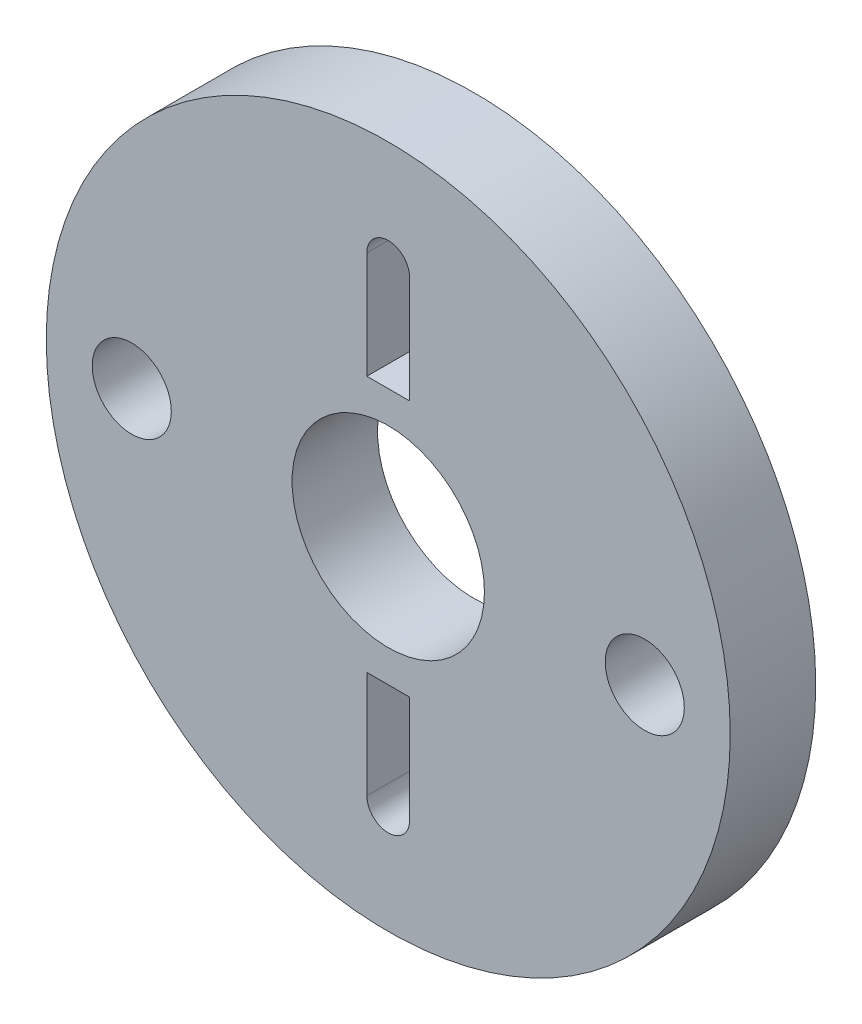
ISO-10303-21;
HEADER;
FILE_DESCRIPTION(('STEP AP214'),'2;1');
FILE_NAME('part.step','',(''),(''),'','','');
FILE_SCHEMA(('AUTOMOTIVE_DESIGN { 1 0 10303 214 1 1 1 1 }'));
ENDSEC;
DATA;
#1=APPLICATION_CONTEXT('core data for automotive mechanical design processes');
#2=APPLICATION_PROTOCOL_DEFINITION('international standard','automotive_design',2000,#1);
#3=PRODUCT_CONTEXT('',#1,'mechanical');
#4=PRODUCT('Part','Part','',(#3));
#5=PRODUCT_RELATED_PRODUCT_CATEGORY('part','',(#4));
#6=PRODUCT_DEFINITION_FORMATION('','',#4);
#7=PRODUCT_DEFINITION_CONTEXT('part definition',#1,'design');
#8=PRODUCT_DEFINITION('design','',#6,#7);
#9=PRODUCT_DEFINITION_SHAPE('','',#8);
#10=(LENGTH_UNIT() NAMED_UNIT(*) SI_UNIT(.MILLI.,.METRE.));
#11=(NAMED_UNIT(*) PLANE_ANGLE_UNIT() SI_UNIT($,.RADIAN.));
#12=(NAMED_UNIT(*) SI_UNIT($,.STERADIAN.) SOLID_ANGLE_UNIT());
#13=UNCERTAINTY_MEASURE_WITH_UNIT(LENGTH_MEASURE(1.E-05),#10,'distance_accuracy_value','');
#14=(GEOMETRIC_REPRESENTATION_CONTEXT(3) GLOBAL_UNCERTAINTY_ASSIGNED_CONTEXT((#13)) GLOBAL_UNIT_ASSIGNED_CONTEXT((#10,
#11,#12)) REPRESENTATION_CONTEXT('',''));
#15=CARTESIAN_POINT('',(0.,0.,0.));
#16=DIRECTION('',(0.,0.,1.));
#17=DIRECTION('',(1.,0.,0.));
#18=AXIS2_PLACEMENT_3D('',#15,#16,#17);
#19=CARTESIAN_POINT('',(0.,0.,2.));
#20=DIRECTION('',(0.,0.,1.));
#21=DIRECTION('',(1.,0.,0.));
#22=AXIS2_PLACEMENT_3D('',#19,#20,#21);
#23=PLANE('',#22);
#24=CARTESIAN_POINT('',(-12.,0.,2.));
#25=DIRECTION('',(0.,0.,1.));
#26=DIRECTION('',(1.,0.,0.));
#27=AXIS2_PLACEMENT_3D('',#24,#25,#26);
#28=CIRCLE('',#27,1.85);
#29=CARTESIAN_POINT('',(-10.15,0.,2.));
#30=VERTEX_POINT('',#29);
#31=EDGE_CURVE('E128',#30,#30,#28,.T.);
#32=ORIENTED_EDGE('',*,*,#31,.F.);
#33=EDGE_LOOP('',(#32));
#34=FACE_BOUND('',#33,.T.);
#35=CARTESIAN_POINT('',(0.,0.,2.));
#36=DIRECTION('',(0.,0.,1.));
#37=DIRECTION('',(1.,0.,0.));
#38=AXIS2_PLACEMENT_3D('',#35,#36,#37);
#39=CIRCLE('',#38,16.);
#40=CARTESIAN_POINT('',(16.,0.,2.));
#41=VERTEX_POINT('',#40);
#42=EDGE_CURVE('E11',#41,#41,#39,.T.);
#43=ORIENTED_EDGE('',*,*,#42,.T.);
#44=EDGE_LOOP('',(#43));
#45=FACE_BOUND('',#44,.T.);
#46=CARTESIAN_POINT('',(0.,0.,2.));
#47=DIRECTION('',(0.,0.,1.));
#48=DIRECTION('',(1.,0.,0.));
#49=AXIS2_PLACEMENT_3D('',#46,#47,#48);
#50=CIRCLE('',#49,4.5);
#51=CARTESIAN_POINT('',(4.5,0.,2.));
#52=VERTEX_POINT('',#51);
#53=EDGE_CURVE('E169',#52,#52,#50,.T.);
#54=ORIENTED_EDGE('',*,*,#53,.F.);
#55=EDGE_LOOP('',(#54));
#56=FACE_BOUND('',#55,.T.);
#57=DIRECTION('',(0.,1.,0.));
#58=VECTOR('',#57,1.);
#59=CARTESIAN_POINT('',(1.,6.,2.));
#60=LINE('',#59,#58);
#61=CARTESIAN_POINT('',(1.,6.,2.));
#62=VERTEX_POINT('',#61);
#63=CARTESIAN_POINT('',(1.,11.,2.));
#64=VERTEX_POINT('',#63);
#65=EDGE_CURVE('E140',#62,#64,#60,.T.);
#66=ORIENTED_EDGE('',*,*,#65,.F.);
#67=DIRECTION('',(1.,0.,0.));
#68=VECTOR('',#67,1.);
#69=CARTESIAN_POINT('',(1.,6.,2.));
#70=LINE('',#69,#68);
#71=CARTESIAN_POINT('',(-1.,6.,2.));
#72=VERTEX_POINT('',#71);
#73=EDGE_CURVE('E138',#72,#62,#70,.T.);
#74=ORIENTED_EDGE('',*,*,#73,.F.);
#75=DIRECTION('',(0.,-1.,0.));
#76=VECTOR('',#75,1.);
#77=CARTESIAN_POINT('',(-1.,6.,2.));
#78=LINE('',#77,#76);
#79=CARTESIAN_POINT('',(-1.,11.,2.));
#80=VERTEX_POINT('',#79);
#81=EDGE_CURVE('E146',#80,#72,#78,.T.);
#82=ORIENTED_EDGE('',*,*,#81,.F.);
#83=CARTESIAN_POINT('',(0.,11.,2.));
#84=DIRECTION('',(0.,0.,1.));
#85=DIRECTION('',(1.,0.,0.));
#86=AXIS2_PLACEMENT_3D('',#83,#84,#85);
#87=CIRCLE('',#86,1.);
#88=EDGE_CURVE('E143',#64,#80,#87,.T.);
#89=ORIENTED_EDGE('',*,*,#88,.F.);
#90=EDGE_LOOP('',(#66,#74,#82,#89));
#91=FACE_BOUND('',#90,.T.);
#92=DIRECTION('',(0.,-1.,0.));
#93=VECTOR('',#92,1.);
#94=CARTESIAN_POINT('',(-1.,-6.,2.));
#95=LINE('',#94,#93);
#96=CARTESIAN_POINT('',(-1.,-6.,2.));
#97=VERTEX_POINT('',#96);
#98=CARTESIAN_POINT('',(-1.,-11.,2.));
#99=VERTEX_POINT('',#98);
#100=EDGE_CURVE('E107',#97,#99,#95,.T.);
#101=ORIENTED_EDGE('',*,*,#100,.F.);
#102=DIRECTION('',(-1.,0.,0.));
#103=VECTOR('',#102,1.);
#104=CARTESIAN_POINT('',(-1.,-6.,2.));
#105=LINE('',#104,#103);
#106=CARTESIAN_POINT('',(1.,-6.,2.));
#107=VERTEX_POINT('',#106);
#108=EDGE_CURVE('E99',#107,#97,#105,.T.);
#109=ORIENTED_EDGE('',*,*,#108,.F.);
#110=DIRECTION('',(0.,1.,0.));
#111=VECTOR('',#110,1.);
#112=CARTESIAN_POINT('',(1.,-6.,2.));
#113=LINE('',#112,#111);
#114=CARTESIAN_POINT('',(1.,-11.,2.));
#115=VERTEX_POINT('',#114);
#116=EDGE_CURVE('E122',#115,#107,#113,.T.);
#117=ORIENTED_EDGE('',*,*,#116,.F.);
#118=CARTESIAN_POINT('',(0.,-11.,2.));
#119=DIRECTION('',(0.,0.,1.));
#120=DIRECTION('',(1.,0.,0.));
#121=AXIS2_PLACEMENT_3D('',#118,#119,#120);
#122=CIRCLE('',#121,1.);
#123=EDGE_CURVE('E120',#99,#115,#122,.T.);
#124=ORIENTED_EDGE('',*,*,#123,.F.);
#125=EDGE_LOOP('',(#101,#109,#117,#124));
#126=FACE_BOUND('',#125,.T.);
#127=CARTESIAN_POINT('',(12.,0.,2.));
#128=DIRECTION('',(0.,0.,1.));
#129=DIRECTION('',(1.,0.,0.));
#130=AXIS2_PLACEMENT_3D('',#127,#128,#129);
#131=CIRCLE('',#130,1.85);
#132=CARTESIAN_POINT('',(13.85,0.,2.));
#133=VERTEX_POINT('',#132);
#134=EDGE_CURVE('E302',#133,#133,#131,.T.);
#135=ORIENTED_EDGE('',*,*,#134,.F.);
#136=EDGE_LOOP('',(#135));
#137=FACE_BOUND('',#136,.T.);
#138=ADVANCED_FACE('F34',(#34,#45,#56,#91,#126,#137),#23,.T.);
#139=CARTESIAN_POINT('',(0.,0.,-2.));
#140=DIRECTION('',(0.,0.,1.));
#141=DIRECTION('',(1.,0.,0.));
#142=AXIS2_PLACEMENT_3D('',#139,#140,#141);
#143=PLANE('',#142);
#144=DIRECTION('',(1.,0.,0.));
#145=VECTOR('',#144,1.);
#146=CARTESIAN_POINT('',(1.,6.,-2.));
#147=LINE('',#146,#145);
#148=CARTESIAN_POINT('',(-1.,6.,-2.));
#149=VERTEX_POINT('',#148);
#150=CARTESIAN_POINT('',(1.,6.,-2.));
#151=VERTEX_POINT('',#150);
#152=EDGE_CURVE('E115',#149,#151,#147,.T.);
#153=ORIENTED_EDGE('',*,*,#152,.T.);
#154=DIRECTION('',(0.,1.,0.));
#155=VECTOR('',#154,1.);
#156=CARTESIAN_POINT('',(1.,6.,-2.));
#157=LINE('',#156,#155);
#158=CARTESIAN_POINT('',(1.,11.,-2.));
#159=VERTEX_POINT('',#158);
#160=EDGE_CURVE('E151',#151,#159,#157,.T.);
#161=ORIENTED_EDGE('',*,*,#160,.T.);
#162=CARTESIAN_POINT('',(0.,11.,-2.));
#163=DIRECTION('',(0.,0.,1.));
#164=DIRECTION('',(1.,0.,0.));
#165=AXIS2_PLACEMENT_3D('',#162,#163,#164);
#166=CIRCLE('',#165,1.);
#167=CARTESIAN_POINT('',(-1.,11.,-2.));
#168=VERTEX_POINT('',#167);
#169=EDGE_CURVE('E154',#159,#168,#166,.T.);
#170=ORIENTED_EDGE('',*,*,#169,.T.);
#171=DIRECTION('',(0.,-1.,0.));
#172=VECTOR('',#171,1.);
#173=CARTESIAN_POINT('',(-1.,6.,-2.));
#174=LINE('',#173,#172);
#175=EDGE_CURVE('E141',#168,#149,#174,.T.);
#176=ORIENTED_EDGE('',*,*,#175,.T.);
#177=EDGE_LOOP('',(#153,#161,#170,#176));
#178=FACE_BOUND('',#177,.T.);
#179=CARTESIAN_POINT('',(0.,0.,-2.));
#180=DIRECTION('',(0.,0.,1.));
#181=DIRECTION('',(1.,0.,0.));
#182=AXIS2_PLACEMENT_3D('',#179,#180,#181);
#183=CIRCLE('',#182,16.);
#184=CARTESIAN_POINT('',(16.,0.,-2.));
#185=VERTEX_POINT('',#184);
#186=EDGE_CURVE('E38',#185,#185,#183,.T.);
#187=ORIENTED_EDGE('',*,*,#186,.F.);
#188=EDGE_LOOP('',(#187));
#189=FACE_BOUND('',#188,.T.);
#190=CARTESIAN_POINT('',(0.,0.,-2.));
#191=DIRECTION('',(0.,0.,1.));
#192=DIRECTION('',(1.,0.,0.));
#193=AXIS2_PLACEMENT_3D('',#190,#191,#192);
#194=CIRCLE('',#193,4.5);
#195=CARTESIAN_POINT('',(4.5,0.,-2.));
#196=VERTEX_POINT('',#195);
#197=EDGE_CURVE('E168',#196,#196,#194,.T.);
#198=ORIENTED_EDGE('',*,*,#197,.T.);
#199=EDGE_LOOP('',(#198));
#200=FACE_BOUND('',#199,.T.);
#201=DIRECTION('',(-1.,0.,0.));
#202=VECTOR('',#201,1.);
#203=CARTESIAN_POINT('',(-1.,-6.,-2.));
#204=LINE('',#203,#202);
#205=CARTESIAN_POINT('',(1.,-6.,-2.));
#206=VERTEX_POINT('',#205);
#207=CARTESIAN_POINT('',(-1.,-6.,-2.));
#208=VERTEX_POINT('',#207);
#209=EDGE_CURVE('E57',#206,#208,#204,.T.);
#210=ORIENTED_EDGE('',*,*,#209,.T.);
#211=DIRECTION('',(0.,-1.,0.));
#212=VECTOR('',#211,1.);
#213=CARTESIAN_POINT('',(-1.,-6.,-2.));
#214=LINE('',#213,#212);
#215=CARTESIAN_POINT('',(-1.,-11.,-2.));
#216=VERTEX_POINT('',#215);
#217=EDGE_CURVE('E114',#208,#216,#214,.T.);
#218=ORIENTED_EDGE('',*,*,#217,.T.);
#219=CARTESIAN_POINT('',(0.,-11.,-2.));
#220=DIRECTION('',(0.,0.,1.));
#221=DIRECTION('',(1.,0.,0.));
#222=AXIS2_PLACEMENT_3D('',#219,#220,#221);
#223=CIRCLE('',#222,1.);
#224=CARTESIAN_POINT('',(1.,-11.,-2.));
#225=VERTEX_POINT('',#224);
#226=EDGE_CURVE('E130',#216,#225,#223,.T.);
#227=ORIENTED_EDGE('',*,*,#226,.T.);
#228=DIRECTION('',(0.,1.,0.));
#229=VECTOR('',#228,1.);
#230=CARTESIAN_POINT('',(1.,-6.,-2.));
#231=LINE('',#230,#229);
#232=EDGE_CURVE('E108',#225,#206,#231,.T.);
#233=ORIENTED_EDGE('',*,*,#232,.T.);
#234=EDGE_LOOP('',(#210,#218,#227,#233));
#235=FACE_BOUND('',#234,.T.);
#236=CARTESIAN_POINT('',(-12.,0.,-2.));
#237=DIRECTION('',(0.,0.,1.));
#238=DIRECTION('',(1.,0.,0.));
#239=AXIS2_PLACEMENT_3D('',#236,#237,#238);
#240=CIRCLE('',#239,1.85);
#241=CARTESIAN_POINT('',(-10.15,0.,-2.));
#242=VERTEX_POINT('',#241);
#243=EDGE_CURVE('E308',#242,#242,#240,.T.);
#244=ORIENTED_EDGE('',*,*,#243,.T.);
#245=EDGE_LOOP('',(#244));
#246=FACE_BOUND('',#245,.T.);
#247=CARTESIAN_POINT('',(12.,0.,-2.));
#248=DIRECTION('',(0.,0.,1.));
#249=DIRECTION('',(1.,0.,0.));
#250=AXIS2_PLACEMENT_3D('',#247,#248,#249);
#251=CIRCLE('',#250,1.85);
#252=CARTESIAN_POINT('',(13.85,0.,-2.));
#253=VERTEX_POINT('',#252);
#254=EDGE_CURVE('E305',#253,#253,#251,.T.);
#255=ORIENTED_EDGE('',*,*,#254,.T.);
#256=EDGE_LOOP('',(#255));
#257=FACE_BOUND('',#256,.T.);
#258=ADVANCED_FACE('F175',(#178,#189,#200,#235,#246,#257),#143,.F.);
#259=CARTESIAN_POINT('',(0.,0.,2.));
#260=DIRECTION('',(0.,0.,-1.));
#261=DIRECTION('',(-1.,0.,0.));
#262=AXIS2_PLACEMENT_3D('',#259,#260,#261);
#263=CYLINDRICAL_SURFACE('',#262,16.);
#264=ORIENTED_EDGE('',*,*,#42,.F.);
#265=EDGE_LOOP('',(#264));
#266=FACE_BOUND('',#265,.T.);
#267=ORIENTED_EDGE('',*,*,#186,.T.);
#268=EDGE_LOOP('',(#267));
#269=FACE_BOUND('',#268,.T.);
#270=ADVANCED_FACE('F36',(#266,#269),#263,.T.);
#271=CARTESIAN_POINT('',(0.,0.,2.));
#272=DIRECTION('',(0.,0.,-1.));
#273=DIRECTION('',(-1.,0.,0.));
#274=AXIS2_PLACEMENT_3D('',#271,#272,#273);
#275=CYLINDRICAL_SURFACE('',#274,4.5);
#276=ORIENTED_EDGE('',*,*,#53,.T.);
#277=EDGE_LOOP('',(#276));
#278=FACE_BOUND('',#277,.T.);
#279=ORIENTED_EDGE('',*,*,#197,.F.);
#280=EDGE_LOOP('',(#279));
#281=FACE_BOUND('',#280,.T.);
#282=ADVANCED_FACE('F178',(#278,#281),#275,.F.);
#283=CARTESIAN_POINT('',(1.,6.,2.));
#284=DIRECTION('',(0.,1.,0.));
#285=DIRECTION('',(0.,0.,1.));
#286=AXIS2_PLACEMENT_3D('',#283,#284,#285);
#287=PLANE('',#286);
#288=ORIENTED_EDGE('',*,*,#152,.F.);
#289=DIRECTION('',(0.,0.,-1.));
#290=VECTOR('',#289,1.);
#291=CARTESIAN_POINT('',(-1.,6.,2.));
#292=LINE('',#291,#290);
#293=EDGE_CURVE('E148',#72,#149,#292,.T.);
#294=ORIENTED_EDGE('',*,*,#293,.F.);
#295=ORIENTED_EDGE('',*,*,#73,.T.);
#296=DIRECTION('',(0.,0.,-1.));
#297=VECTOR('',#296,1.);
#298=CARTESIAN_POINT('',(1.,6.,2.));
#299=LINE('',#298,#297);
#300=EDGE_CURVE('E165',#62,#151,#299,.T.);
#301=ORIENTED_EDGE('',*,*,#300,.T.);
#302=EDGE_LOOP('',(#288,#294,#295,#301));
#303=FACE_BOUND('',#302,.T.);
#304=ADVANCED_FACE('F180',(#303),#287,.T.);
#305=CARTESIAN_POINT('',(1.,6.,2.));
#306=DIRECTION('',(-1.,0.,0.));
#307=DIRECTION('',(0.,0.,1.));
#308=AXIS2_PLACEMENT_3D('',#305,#306,#307);
#309=PLANE('',#308);
#310=ORIENTED_EDGE('',*,*,#160,.F.);
#311=ORIENTED_EDGE('',*,*,#300,.F.);
#312=ORIENTED_EDGE('',*,*,#65,.T.);
#313=DIRECTION('',(0.,0.,-1.));
#314=VECTOR('',#313,1.);
#315=CARTESIAN_POINT('',(1.,11.,2.));
#316=LINE('',#315,#314);
#317=EDGE_CURVE('E163',#64,#159,#316,.T.);
#318=ORIENTED_EDGE('',*,*,#317,.T.);
#319=EDGE_LOOP('',(#310,#311,#312,#318));
#320=FACE_BOUND('',#319,.T.);
#321=ADVANCED_FACE('F187',(#320),#309,.T.);
#322=CARTESIAN_POINT('',(0.,11.,2.));
#323=DIRECTION('',(0.,0.,-1.));
#324=DIRECTION('',(-1.,0.,0.));
#325=AXIS2_PLACEMENT_3D('',#322,#323,#324);
#326=CYLINDRICAL_SURFACE('',#325,1.);
#327=ORIENTED_EDGE('',*,*,#169,.F.);
#328=ORIENTED_EDGE('',*,*,#317,.F.);
#329=ORIENTED_EDGE('',*,*,#88,.T.);
#330=DIRECTION('',(0.,0.,-1.));
#331=VECTOR('',#330,1.);
#332=CARTESIAN_POINT('',(-1.,11.,2.));
#333=LINE('',#332,#331);
#334=EDGE_CURVE('E161',#80,#168,#333,.T.);
#335=ORIENTED_EDGE('',*,*,#334,.T.);
#336=EDGE_LOOP('',(#327,#328,#329,#335));
#337=FACE_BOUND('',#336,.T.);
#338=ADVANCED_FACE('F214',(#337),#326,.F.);
#339=CARTESIAN_POINT('',(-1.,6.,2.));
#340=DIRECTION('',(1.,0.,0.));
#341=DIRECTION('',(0.,0.,-1.));
#342=AXIS2_PLACEMENT_3D('',#339,#340,#341);
#343=PLANE('',#342);
#344=ORIENTED_EDGE('',*,*,#175,.F.);
#345=ORIENTED_EDGE('',*,*,#334,.F.);
#346=ORIENTED_EDGE('',*,*,#81,.T.);
#347=ORIENTED_EDGE('',*,*,#293,.T.);
#348=EDGE_LOOP('',(#344,#345,#346,#347));
#349=FACE_BOUND('',#348,.T.);
#350=ADVANCED_FACE('F219',(#349),#343,.T.);
#351=CARTESIAN_POINT('',(-1.,-6.,2.));
#352=DIRECTION('',(0.,-1.,0.));
#353=DIRECTION('',(0.,0.,-1.));
#354=AXIS2_PLACEMENT_3D('',#351,#352,#353);
#355=PLANE('',#354);
#356=ORIENTED_EDGE('',*,*,#209,.F.);
#357=DIRECTION('',(0.,0.,-1.));
#358=VECTOR('',#357,1.);
#359=CARTESIAN_POINT('',(1.,-6.,2.));
#360=LINE('',#359,#358);
#361=EDGE_CURVE('E103',#107,#206,#360,.T.);
#362=ORIENTED_EDGE('',*,*,#361,.F.);
#363=ORIENTED_EDGE('',*,*,#108,.T.);
#364=DIRECTION('',(0.,0.,-1.));
#365=VECTOR('',#364,1.);
#366=CARTESIAN_POINT('',(-1.,-6.,2.));
#367=LINE('',#366,#365);
#368=EDGE_CURVE('E102',#97,#208,#367,.T.);
#369=ORIENTED_EDGE('',*,*,#368,.T.);
#370=EDGE_LOOP('',(#356,#362,#363,#369));
#371=FACE_BOUND('',#370,.T.);
#372=ADVANCED_FACE('F101',(#371),#355,.T.);
#373=CARTESIAN_POINT('',(-1.,-6.,2.));
#374=DIRECTION('',(1.,0.,0.));
#375=DIRECTION('',(0.,1.,0.));
#376=AXIS2_PLACEMENT_3D('',#373,#374,#375);
#377=PLANE('',#376);
#378=ORIENTED_EDGE('',*,*,#217,.F.);
#379=ORIENTED_EDGE('',*,*,#368,.F.);
#380=ORIENTED_EDGE('',*,*,#100,.T.);
#381=DIRECTION('',(0.,0.,-1.));
#382=VECTOR('',#381,1.);
#383=CARTESIAN_POINT('',(-1.,-11.,2.));
#384=LINE('',#383,#382);
#385=EDGE_CURVE('E116',#99,#216,#384,.T.);
#386=ORIENTED_EDGE('',*,*,#385,.T.);
#387=EDGE_LOOP('',(#378,#379,#380,#386));
#388=FACE_BOUND('',#387,.T.);
#389=ADVANCED_FACE('F111',(#388),#377,.T.);
#390=CARTESIAN_POINT('',(0.,-11.,2.));
#391=DIRECTION('',(0.,0.,-1.));
#392=DIRECTION('',(-1.,0.,0.));
#393=AXIS2_PLACEMENT_3D('',#390,#391,#392);
#394=CYLINDRICAL_SURFACE('',#393,1.);
#395=ORIENTED_EDGE('',*,*,#226,.F.);
#396=ORIENTED_EDGE('',*,*,#385,.F.);
#397=ORIENTED_EDGE('',*,*,#123,.T.);
#398=DIRECTION('',(0.,0.,-1.));
#399=VECTOR('',#398,1.);
#400=CARTESIAN_POINT('',(1.,-11.,2.));
#401=LINE('',#400,#399);
#402=EDGE_CURVE('E49',#115,#225,#401,.T.);
#403=ORIENTED_EDGE('',*,*,#402,.T.);
#404=EDGE_LOOP('',(#395,#396,#397,#403));
#405=FACE_BOUND('',#404,.T.);
#406=ADVANCED_FACE('F258',(#405),#394,.F.);
#407=CARTESIAN_POINT('',(1.,-6.,2.));
#408=DIRECTION('',(-1.,0.,0.));
#409=DIRECTION('',(0.,-1.,0.));
#410=AXIS2_PLACEMENT_3D('',#407,#408,#409);
#411=PLANE('',#410);
#412=ORIENTED_EDGE('',*,*,#232,.F.);
#413=ORIENTED_EDGE('',*,*,#402,.F.);
#414=ORIENTED_EDGE('',*,*,#116,.T.);
#415=ORIENTED_EDGE('',*,*,#361,.T.);
#416=EDGE_LOOP('',(#412,#413,#414,#415));
#417=FACE_BOUND('',#416,.T.);
#418=ADVANCED_FACE('F266',(#417),#411,.T.);
#419=CARTESIAN_POINT('',(-12.,0.,2.));
#420=DIRECTION('',(0.,0.,-1.));
#421=DIRECTION('',(-1.,0.,0.));
#422=AXIS2_PLACEMENT_3D('',#419,#420,#421);
#423=CYLINDRICAL_SURFACE('',#422,1.85);
#424=ORIENTED_EDGE('',*,*,#31,.T.);
#425=EDGE_LOOP('',(#424));
#426=FACE_BOUND('',#425,.T.);
#427=ORIENTED_EDGE('',*,*,#243,.F.);
#428=EDGE_LOOP('',(#427));
#429=FACE_BOUND('',#428,.T.);
#430=ADVANCED_FACE('F276',(#426,#429),#423,.F.);
#431=CARTESIAN_POINT('',(12.,0.,2.));
#432=DIRECTION('',(0.,0.,-1.));
#433=DIRECTION('',(-1.,0.,0.));
#434=AXIS2_PLACEMENT_3D('',#431,#432,#433);
#435=CYLINDRICAL_SURFACE('',#434,1.85);
#436=ORIENTED_EDGE('',*,*,#134,.T.);
#437=EDGE_LOOP('',(#436));
#438=FACE_BOUND('',#437,.T.);
#439=ORIENTED_EDGE('',*,*,#254,.F.);
#440=EDGE_LOOP('',(#439));
#441=FACE_BOUND('',#440,.T.);
#442=ADVANCED_FACE('F285',(#438,#441),#435,.F.);
#443=CLOSED_SHELL('',(#138,#258,#270,#282,#304,#321,#338,#350,#372,#389,#406,#418,#430,#442));
#444=MANIFOLD_SOLID_BREP('B2',#443);
#445=ADVANCED_BREP_SHAPE_REPRESENTATION('',(#18,#444),#14);
#446=SHAPE_DEFINITION_REPRESENTATION(#9,#445);
ENDSEC;
END-ISO-10303-21;
